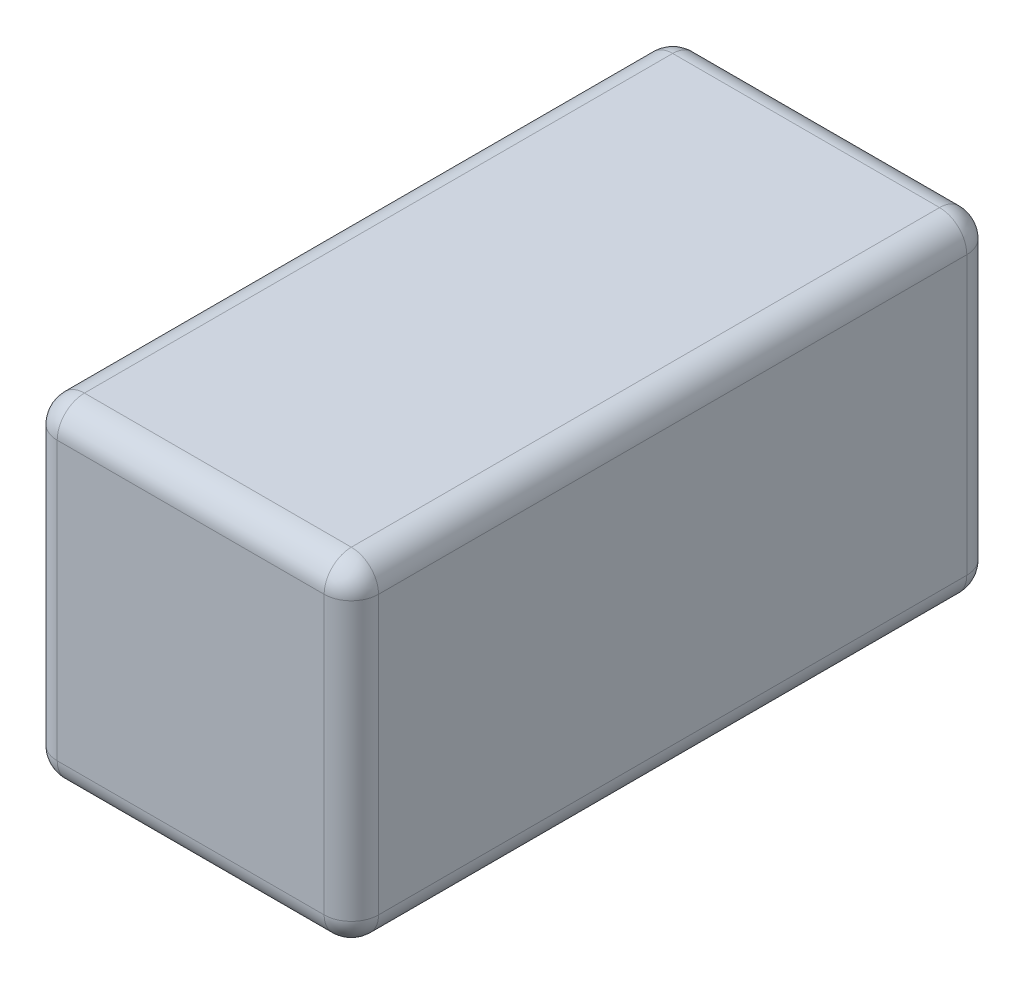
ISO-10303-21;
HEADER;
FILE_DESCRIPTION(('STEP AP214'),'2;1');
FILE_NAME('part.step','',(''),(''),'','','');
FILE_SCHEMA(('AUTOMOTIVE_DESIGN { 1 0 10303 214 1 1 1 1 }'));
ENDSEC;
DATA;
#1=APPLICATION_CONTEXT('core data for automotive mechanical design processes');
#2=APPLICATION_PROTOCOL_DEFINITION('international standard','automotive_design',2000,#1);
#3=PRODUCT_CONTEXT('',#1,'mechanical');
#4=PRODUCT('Part','Part','',(#3));
#5=PRODUCT_RELATED_PRODUCT_CATEGORY('part','',(#4));
#6=PRODUCT_DEFINITION_FORMATION('','',#4);
#7=PRODUCT_DEFINITION_CONTEXT('part definition',#1,'design');
#8=PRODUCT_DEFINITION('design','',#6,#7);
#9=PRODUCT_DEFINITION_SHAPE('','',#8);
#10=(LENGTH_UNIT() NAMED_UNIT(*) SI_UNIT(.MILLI.,.METRE.));
#11=(NAMED_UNIT(*) PLANE_ANGLE_UNIT() SI_UNIT($,.RADIAN.));
#12=(NAMED_UNIT(*) SI_UNIT($,.STERADIAN.) SOLID_ANGLE_UNIT());
#13=UNCERTAINTY_MEASURE_WITH_UNIT(LENGTH_MEASURE(1.E-05),#10,'distance_accuracy_value','');
#14=(GEOMETRIC_REPRESENTATION_CONTEXT(3) GLOBAL_UNCERTAINTY_ASSIGNED_CONTEXT((#13)) GLOBAL_UNIT_ASSIGNED_CONTEXT((#10,
#11,#12)) REPRESENTATION_CONTEXT('',''));
#15=CARTESIAN_POINT('',(0.,0.,0.));
#16=DIRECTION('',(0.,0.,1.));
#17=DIRECTION('',(1.,0.,0.));
#18=AXIS2_PLACEMENT_3D('',#15,#16,#17);
#19=CARTESIAN_POINT('',(-15.,-15.5,60.));
#20=DIRECTION('',(1.,0.,0.));
#21=DIRECTION('',(0.,0.,-1.));
#22=AXIS2_PLACEMENT_3D('',#19,#20,#21);
#23=PLANE('',#22);
#24=DIRECTION('',(0.,-1.,0.));
#25=VECTOR('',#24,1.);
#26=CARTESIAN_POINT('',(-15.,-15.5,2.54));
#27=LINE('',#26,#25);
#28=CARTESIAN_POINT('',(-15.,12.96,2.54));
#29=VERTEX_POINT('',#28);
#30=CARTESIAN_POINT('',(-15.,-12.96,2.54));
#31=VERTEX_POINT('',#30);
#32=EDGE_CURVE('E131',#29,#31,#27,.T.);
#33=ORIENTED_EDGE('',*,*,#32,.T.);
#34=DIRECTION('',(0.,0.,-1.));
#35=VECTOR('',#34,1.);
#36=CARTESIAN_POINT('',(-15.,-12.96,60.));
#37=LINE('',#36,#35);
#38=CARTESIAN_POINT('',(-15.,-12.96,57.46));
#39=VERTEX_POINT('',#38);
#40=EDGE_CURVE('E127',#31,#39,#37,.F.);
#41=ORIENTED_EDGE('',*,*,#40,.T.);
#42=DIRECTION('',(0.,-1.,0.));
#43=VECTOR('',#42,1.);
#44=CARTESIAN_POINT('',(-15.,15.5,57.46));
#45=LINE('',#44,#43);
#46=CARTESIAN_POINT('',(-15.,12.96,57.46));
#47=VERTEX_POINT('',#46);
#48=EDGE_CURVE('E120',#39,#47,#45,.F.);
#49=ORIENTED_EDGE('',*,*,#48,.T.);
#50=DIRECTION('',(0.,0.,-1.));
#51=VECTOR('',#50,1.);
#52=CARTESIAN_POINT('',(-15.,12.96,60.));
#53=LINE('',#52,#51);
#54=EDGE_CURVE('E124',#47,#29,#53,.T.);
#55=ORIENTED_EDGE('',*,*,#54,.T.);
#56=EDGE_LOOP('',(#33,#41,#49,#55));
#57=FACE_BOUND('',#56,.T.);
#58=ADVANCED_FACE('F33',(#57),#23,.F.);
#59=CARTESIAN_POINT('',(15.,-15.5,60.));
#60=DIRECTION('',(0.,1.,0.));
#61=DIRECTION('',(-1.,0.,0.));
#62=AXIS2_PLACEMENT_3D('',#59,#60,#61);
#63=PLANE('',#62);
#64=DIRECTION('',(1.,0.,0.));
#65=VECTOR('',#64,1.);
#66=CARTESIAN_POINT('',(-15.,-15.5,57.46));
#67=LINE('',#66,#65);
#68=CARTESIAN_POINT('',(12.46,-15.5,57.46));
#69=VERTEX_POINT('',#68);
#70=CARTESIAN_POINT('',(-12.46,-15.5,57.46));
#71=VERTEX_POINT('',#70);
#72=EDGE_CURVE('E183',#69,#71,#67,.F.);
#73=ORIENTED_EDGE('',*,*,#72,.T.);
#74=DIRECTION('',(0.,0.,-1.));
#75=VECTOR('',#74,1.);
#76=CARTESIAN_POINT('',(-12.46,-15.5,60.));
#77=LINE('',#76,#75);
#78=CARTESIAN_POINT('',(-12.46,-15.5,2.54));
#79=VERTEX_POINT('',#78);
#80=EDGE_CURVE('E185',#71,#79,#77,.T.);
#81=ORIENTED_EDGE('',*,*,#80,.T.);
#82=DIRECTION('',(1.,0.,0.));
#83=VECTOR('',#82,1.);
#84=CARTESIAN_POINT('',(15.,-15.5,2.54));
#85=LINE('',#84,#83);
#86=CARTESIAN_POINT('',(12.46,-15.5,2.54));
#87=VERTEX_POINT('',#86);
#88=EDGE_CURVE('E181',#79,#87,#85,.T.);
#89=ORIENTED_EDGE('',*,*,#88,.T.);
#90=DIRECTION('',(0.,0.,-1.));
#91=VECTOR('',#90,1.);
#92=CARTESIAN_POINT('',(12.46,-15.5,60.));
#93=LINE('',#92,#91);
#94=EDGE_CURVE('E179',#87,#69,#93,.F.);
#95=ORIENTED_EDGE('',*,*,#94,.T.);
#96=EDGE_LOOP('',(#73,#81,#89,#95));
#97=FACE_BOUND('',#96,.T.);
#98=ADVANCED_FACE('F263',(#97),#63,.F.);
#99=CARTESIAN_POINT('',(15.,-15.5,60.));
#100=DIRECTION('',(-1.,0.,0.));
#101=DIRECTION('',(0.,0.,1.));
#102=AXIS2_PLACEMENT_3D('',#99,#100,#101);
#103=PLANE('',#102);
#104=DIRECTION('',(0.,1.,0.));
#105=VECTOR('',#104,1.);
#106=CARTESIAN_POINT('',(15.,-15.5,57.46));
#107=LINE('',#106,#105);
#108=CARTESIAN_POINT('',(15.,12.96,57.46));
#109=VERTEX_POINT('',#108);
#110=CARTESIAN_POINT('',(15.,-12.96,57.46));
#111=VERTEX_POINT('',#110);
#112=EDGE_CURVE('E192',#109,#111,#107,.F.);
#113=ORIENTED_EDGE('',*,*,#112,.T.);
#114=DIRECTION('',(0.,0.,-1.));
#115=VECTOR('',#114,1.);
#116=CARTESIAN_POINT('',(15.,-12.96,60.));
#117=LINE('',#116,#115);
#118=CARTESIAN_POINT('',(15.,-12.96,2.54));
#119=VERTEX_POINT('',#118);
#120=EDGE_CURVE('E194',#111,#119,#117,.T.);
#121=ORIENTED_EDGE('',*,*,#120,.T.);
#122=DIRECTION('',(0.,1.,0.));
#123=VECTOR('',#122,1.);
#124=CARTESIAN_POINT('',(15.,-15.5,2.54));
#125=LINE('',#124,#123);
#126=CARTESIAN_POINT('',(15.,12.96,2.54));
#127=VERTEX_POINT('',#126);
#128=EDGE_CURVE('E190',#119,#127,#125,.T.);
#129=ORIENTED_EDGE('',*,*,#128,.T.);
#130=DIRECTION('',(0.,0.,-1.));
#131=VECTOR('',#130,1.);
#132=CARTESIAN_POINT('',(15.,12.96,60.));
#133=LINE('',#132,#131);
#134=EDGE_CURVE('E188',#127,#109,#133,.F.);
#135=ORIENTED_EDGE('',*,*,#134,.T.);
#136=EDGE_LOOP('',(#113,#121,#129,#135));
#137=FACE_BOUND('',#136,.T.);
#138=ADVANCED_FACE('F272',(#137),#103,.F.);
#139=CARTESIAN_POINT('',(15.,15.5,60.));
#140=DIRECTION('',(0.,-1.,0.));
#141=DIRECTION('',(1.,0.,0.));
#142=AXIS2_PLACEMENT_3D('',#139,#140,#141);
#143=PLANE('',#142);
#144=DIRECTION('',(-1.,0.,0.));
#145=VECTOR('',#144,1.);
#146=CARTESIAN_POINT('',(15.,15.5,57.46));
#147=LINE('',#146,#145);
#148=CARTESIAN_POINT('',(-12.46,15.5,57.46));
#149=VERTEX_POINT('',#148);
#150=CARTESIAN_POINT('',(12.46,15.5,57.46));
#151=VERTEX_POINT('',#150);
#152=EDGE_CURVE('E42',#149,#151,#147,.F.);
#153=ORIENTED_EDGE('',*,*,#152,.T.);
#154=DIRECTION('',(0.,0.,-1.));
#155=VECTOR('',#154,1.);
#156=CARTESIAN_POINT('',(12.46,15.5,60.));
#157=LINE('',#156,#155);
#158=CARTESIAN_POINT('',(12.46,15.5,2.54));
#159=VERTEX_POINT('',#158);
#160=EDGE_CURVE('E11',#151,#159,#157,.T.);
#161=ORIENTED_EDGE('',*,*,#160,.T.);
#162=DIRECTION('',(-1.,0.,0.));
#163=VECTOR('',#162,1.);
#164=CARTESIAN_POINT('',(15.,15.5,2.54));
#165=LINE('',#164,#163);
#166=CARTESIAN_POINT('',(-12.46,15.5,2.54));
#167=VERTEX_POINT('',#166);
#168=EDGE_CURVE('E197',#159,#167,#165,.T.);
#169=ORIENTED_EDGE('',*,*,#168,.T.);
#170=DIRECTION('',(0.,0.,-1.));
#171=VECTOR('',#170,1.);
#172=CARTESIAN_POINT('',(-12.46,15.5,60.));
#173=LINE('',#172,#171);
#174=EDGE_CURVE('E53',#167,#149,#173,.F.);
#175=ORIENTED_EDGE('',*,*,#174,.T.);
#176=EDGE_LOOP('',(#153,#161,#169,#175));
#177=FACE_BOUND('',#176,.T.);
#178=ADVANCED_FACE('F285',(#177),#143,.F.);
#179=CARTESIAN_POINT('',(0.,0.,60.));
#180=DIRECTION('',(0.,0.,1.));
#181=DIRECTION('',(1.,0.,0.));
#182=AXIS2_PLACEMENT_3D('',#179,#180,#181);
#183=PLANE('',#182);
#184=DIRECTION('',(-1.,0.,0.));
#185=VECTOR('',#184,1.);
#186=CARTESIAN_POINT('',(-15.,12.96,60.));
#187=LINE('',#186,#185);
#188=CARTESIAN_POINT('',(12.46,12.96,60.));
#189=VERTEX_POINT('',#188);
#190=CARTESIAN_POINT('',(-12.46,12.96,60.));
#191=VERTEX_POINT('',#190);
#192=EDGE_CURVE('E172',#189,#191,#187,.T.);
#193=ORIENTED_EDGE('',*,*,#192,.T.);
#194=DIRECTION('',(0.,-1.,0.));
#195=VECTOR('',#194,1.);
#196=CARTESIAN_POINT('',(-12.46,-15.5,60.));
#197=LINE('',#196,#195);
#198=CARTESIAN_POINT('',(-12.46,-12.96,60.));
#199=VERTEX_POINT('',#198);
#200=EDGE_CURVE('E139',#191,#199,#197,.T.);
#201=ORIENTED_EDGE('',*,*,#200,.T.);
#202=DIRECTION('',(1.,0.,0.));
#203=VECTOR('',#202,1.);
#204=CARTESIAN_POINT('',(15.,-12.96,60.));
#205=LINE('',#204,#203);
#206=CARTESIAN_POINT('',(12.46,-12.96,60.));
#207=VERTEX_POINT('',#206);
#208=EDGE_CURVE('E176',#199,#207,#205,.T.);
#209=ORIENTED_EDGE('',*,*,#208,.T.);
#210=DIRECTION('',(0.,1.,0.));
#211=VECTOR('',#210,1.);
#212=CARTESIAN_POINT('',(12.46,15.5,60.));
#213=LINE('',#212,#211);
#214=EDGE_CURVE('E174',#207,#189,#213,.T.);
#215=ORIENTED_EDGE('',*,*,#214,.T.);
#216=EDGE_LOOP('',(#193,#201,#209,#215));
#217=FACE_BOUND('',#216,.T.);
#218=ADVANCED_FACE('F477',(#217),#183,.T.);
#219=CARTESIAN_POINT('',(0.,0.,0.));
#220=DIRECTION('',(0.,0.,1.));
#221=DIRECTION('',(1.,0.,0.));
#222=AXIS2_PLACEMENT_3D('',#219,#220,#221);
#223=PLANE('',#222);
#224=DIRECTION('',(1.,0.,0.));
#225=VECTOR('',#224,1.);
#226=CARTESIAN_POINT('',(0.,-12.96,0.));
#227=LINE('',#226,#225);
#228=CARTESIAN_POINT('',(12.46,-12.96,0.));
#229=VERTEX_POINT('',#228);
#230=CARTESIAN_POINT('',(-12.46,-12.96,0.));
#231=VERTEX_POINT('',#230);
#232=EDGE_CURVE('E167',#229,#231,#227,.F.);
#233=ORIENTED_EDGE('',*,*,#232,.T.);
#234=DIRECTION('',(0.,-1.,0.));
#235=VECTOR('',#234,1.);
#236=CARTESIAN_POINT('',(-12.46,0.,0.));
#237=LINE('',#236,#235);
#238=CARTESIAN_POINT('',(-12.46,12.96,0.));
#239=VERTEX_POINT('',#238);
#240=EDGE_CURVE('E169',#231,#239,#237,.F.);
#241=ORIENTED_EDGE('',*,*,#240,.T.);
#242=DIRECTION('',(-1.,0.,0.));
#243=VECTOR('',#242,1.);
#244=CARTESIAN_POINT('',(0.,12.96,0.));
#245=LINE('',#244,#243);
#246=CARTESIAN_POINT('',(12.46,12.96,0.));
#247=VERTEX_POINT('',#246);
#248=EDGE_CURVE('E163',#239,#247,#245,.F.);
#249=ORIENTED_EDGE('',*,*,#248,.T.);
#250=DIRECTION('',(0.,1.,0.));
#251=VECTOR('',#250,1.);
#252=CARTESIAN_POINT('',(12.46,0.,0.));
#253=LINE('',#252,#251);
#254=EDGE_CURVE('E165',#247,#229,#253,.F.);
#255=ORIENTED_EDGE('',*,*,#254,.T.);
#256=EDGE_LOOP('',(#233,#241,#249,#255));
#257=FACE_BOUND('',#256,.T.);
#258=ADVANCED_FACE('F470',(#257),#223,.F.);
#259=CARTESIAN_POINT('',(12.46,0.,57.46));
#260=DIRECTION('',(0.,-1.,0.));
#261=DIRECTION('',(0.,0.,-1.));
#262=AXIS2_PLACEMENT_3D('',#259,#260,#261);
#263=CYLINDRICAL_SURFACE('',#262,2.54);
#264=CARTESIAN_POINT('',(12.46,12.96,57.46));
#265=DIRECTION('',(0.,1.,0.));
#266=DIRECTION('',(0.,0.,1.));
#267=AXIS2_PLACEMENT_3D('',#264,#265,#266);
#268=CIRCLE('',#267,2.54);
#269=EDGE_CURVE('E37',#189,#109,#268,.T.);
#270=ORIENTED_EDGE('',*,*,#269,.F.);
#271=ORIENTED_EDGE('',*,*,#214,.F.);
#272=CARTESIAN_POINT('',(12.46,-12.96,57.46));
#273=DIRECTION('',(0.,-1.,0.));
#274=DIRECTION('',(0.,0.,-1.));
#275=AXIS2_PLACEMENT_3D('',#272,#273,#274);
#276=CIRCLE('',#275,2.54);
#277=EDGE_CURVE('E159',#111,#207,#276,.T.);
#278=ORIENTED_EDGE('',*,*,#277,.F.);
#279=ORIENTED_EDGE('',*,*,#112,.F.);
#280=EDGE_LOOP('',(#270,#271,#278,#279));
#281=FACE_BOUND('',#280,.T.);
#282=ADVANCED_FACE('F35',(#281),#263,.T.);
#283=CARTESIAN_POINT('',(12.46,12.96,57.46));
#284=DIRECTION('',(0.,0.,1.));
#285=DIRECTION('',(1.,0.,0.));
#286=AXIS2_PLACEMENT_3D('',#283,#284,#285);
#287=SPHERICAL_SURFACE('',#286,2.54);
#288=CARTESIAN_POINT('',(12.46,12.96,57.46));
#289=DIRECTION('',(1.,0.,0.));
#290=DIRECTION('',(0.,0.,-1.));
#291=AXIS2_PLACEMENT_3D('',#288,#289,#290);
#292=CIRCLE('',#291,2.54);
#293=EDGE_CURVE('E242',#189,#151,#292,.F.);
#294=ORIENTED_EDGE('',*,*,#293,.F.);
#295=ORIENTED_EDGE('',*,*,#269,.T.);
#296=CARTESIAN_POINT('',(12.46,12.96,57.46));
#297=DIRECTION('',(0.,0.,1.));
#298=DIRECTION('',(1.,0.,0.));
#299=AXIS2_PLACEMENT_3D('',#296,#297,#298);
#300=CIRCLE('',#299,2.54);
#301=EDGE_CURVE('E244',#151,#109,#300,.F.);
#302=ORIENTED_EDGE('',*,*,#301,.F.);
#303=EDGE_LOOP('',(#294,#295,#302));
#304=FACE_BOUND('',#303,.T.);
#305=ADVANCED_FACE('F278',(#304),#287,.T.);
#306=CARTESIAN_POINT('',(12.46,-12.96,57.46));
#307=DIRECTION('',(0.,0.,1.));
#308=DIRECTION('',(1.,0.,0.));
#309=AXIS2_PLACEMENT_3D('',#306,#307,#308);
#310=SPHERICAL_SURFACE('',#309,2.54);
#311=CARTESIAN_POINT('',(12.46,-12.96,57.46));
#312=DIRECTION('',(0.,0.,1.));
#313=DIRECTION('',(1.,0.,0.));
#314=AXIS2_PLACEMENT_3D('',#311,#312,#313);
#315=CIRCLE('',#314,2.54);
#316=EDGE_CURVE('E236',#111,#69,#315,.F.);
#317=ORIENTED_EDGE('',*,*,#316,.F.);
#318=ORIENTED_EDGE('',*,*,#277,.T.);
#319=CARTESIAN_POINT('',(12.46,-12.96,57.46));
#320=DIRECTION('',(1.,0.,0.));
#321=DIRECTION('',(0.,0.,-1.));
#322=AXIS2_PLACEMENT_3D('',#319,#320,#321);
#323=CIRCLE('',#322,2.54);
#324=EDGE_CURVE('E239',#69,#207,#323,.F.);
#325=ORIENTED_EDGE('',*,*,#324,.F.);
#326=EDGE_LOOP('',(#317,#318,#325));
#327=FACE_BOUND('',#326,.T.);
#328=ADVANCED_FACE('F251',(#327),#310,.T.);
#329=CARTESIAN_POINT('',(12.46,12.96,60.));
#330=DIRECTION('',(0.,0.,-1.));
#331=DIRECTION('',(-1.,0.,0.));
#332=AXIS2_PLACEMENT_3D('',#329,#330,#331);
#333=CYLINDRICAL_SURFACE('',#332,2.54);
#334=ORIENTED_EDGE('',*,*,#301,.T.);
#335=ORIENTED_EDGE('',*,*,#134,.F.);
#336=CARTESIAN_POINT('',(12.46,12.96,2.54));
#337=DIRECTION('',(0.,0.,-1.));
#338=DIRECTION('',(-1.,0.,0.));
#339=AXIS2_PLACEMENT_3D('',#336,#337,#338);
#340=CIRCLE('',#339,2.54);
#341=EDGE_CURVE('E230',#159,#127,#340,.T.);
#342=ORIENTED_EDGE('',*,*,#341,.F.);
#343=ORIENTED_EDGE('',*,*,#160,.F.);
#344=EDGE_LOOP('',(#334,#335,#342,#343));
#345=FACE_BOUND('',#344,.T.);
#346=ADVANCED_FACE('F282',(#345),#333,.T.);
#347=CARTESIAN_POINT('',(0.,12.96,57.46));
#348=DIRECTION('',(1.,0.,0.));
#349=DIRECTION('',(0.,1.,0.));
#350=AXIS2_PLACEMENT_3D('',#347,#348,#349);
#351=CYLINDRICAL_SURFACE('',#350,2.54);
#352=ORIENTED_EDGE('',*,*,#293,.T.);
#353=ORIENTED_EDGE('',*,*,#152,.F.);
#354=CARTESIAN_POINT('',(-12.46,12.96,57.46));
#355=DIRECTION('',(-1.,0.,0.));
#356=DIRECTION('',(0.,0.,1.));
#357=AXIS2_PLACEMENT_3D('',#354,#355,#356);
#358=CIRCLE('',#357,2.54);
#359=EDGE_CURVE('E143',#191,#149,#358,.T.);
#360=ORIENTED_EDGE('',*,*,#359,.F.);
#361=ORIENTED_EDGE('',*,*,#192,.F.);
#362=EDGE_LOOP('',(#352,#353,#360,#361));
#363=FACE_BOUND('',#362,.T.);
#364=ADVANCED_FACE('F434',(#363),#351,.T.);
#365=CARTESIAN_POINT('',(-12.46,0.,57.46));
#366=DIRECTION('',(0.,1.,0.));
#367=DIRECTION('',(0.,0.,1.));
#368=AXIS2_PLACEMENT_3D('',#365,#366,#367);
#369=CYLINDRICAL_SURFACE('',#368,2.54);
#370=CARTESIAN_POINT('',(-12.46,-12.96,57.46));
#371=DIRECTION('',(0.,-1.,0.));
#372=DIRECTION('',(0.,0.,-1.));
#373=AXIS2_PLACEMENT_3D('',#370,#371,#372);
#374=CIRCLE('',#373,2.54);
#375=EDGE_CURVE('E144',#199,#39,#374,.T.);
#376=ORIENTED_EDGE('',*,*,#375,.F.);
#377=ORIENTED_EDGE('',*,*,#200,.F.);
#378=CARTESIAN_POINT('',(-12.46,12.96,57.46));
#379=DIRECTION('',(0.,1.,0.));
#380=DIRECTION('',(0.,0.,1.));
#381=AXIS2_PLACEMENT_3D('',#378,#379,#380);
#382=CIRCLE('',#381,2.54);
#383=EDGE_CURVE('E135',#47,#191,#382,.T.);
#384=ORIENTED_EDGE('',*,*,#383,.F.);
#385=ORIENTED_EDGE('',*,*,#48,.F.);
#386=EDGE_LOOP('',(#376,#377,#384,#385));
#387=FACE_BOUND('',#386,.T.);
#388=ADVANCED_FACE('F137',(#387),#369,.T.);
#389=CARTESIAN_POINT('',(0.,-12.96,57.46));
#390=DIRECTION('',(-1.,0.,0.));
#391=DIRECTION('',(0.,-1.,0.));
#392=AXIS2_PLACEMENT_3D('',#389,#390,#391);
#393=CYLINDRICAL_SURFACE('',#392,2.54);
#394=ORIENTED_EDGE('',*,*,#324,.T.);
#395=ORIENTED_EDGE('',*,*,#208,.F.);
#396=CARTESIAN_POINT('',(-12.46,-12.96,57.46));
#397=DIRECTION('',(-1.,0.,0.));
#398=DIRECTION('',(0.,0.,1.));
#399=AXIS2_PLACEMENT_3D('',#396,#397,#398);
#400=CIRCLE('',#399,2.54);
#401=EDGE_CURVE('E226',#71,#199,#400,.T.);
#402=ORIENTED_EDGE('',*,*,#401,.F.);
#403=ORIENTED_EDGE('',*,*,#72,.F.);
#404=EDGE_LOOP('',(#394,#395,#402,#403));
#405=FACE_BOUND('',#404,.T.);
#406=ADVANCED_FACE('F259',(#405),#393,.T.);
#407=CARTESIAN_POINT('',(12.46,-12.96,60.));
#408=DIRECTION('',(0.,0.,-1.));
#409=DIRECTION('',(-1.,0.,0.));
#410=AXIS2_PLACEMENT_3D('',#407,#408,#409);
#411=CYLINDRICAL_SURFACE('',#410,2.54);
#412=ORIENTED_EDGE('',*,*,#316,.T.);
#413=ORIENTED_EDGE('',*,*,#94,.F.);
#414=CARTESIAN_POINT('',(12.46,-12.96,2.54));
#415=DIRECTION('',(0.,0.,-1.));
#416=DIRECTION('',(-1.,0.,0.));
#417=AXIS2_PLACEMENT_3D('',#414,#415,#416);
#418=CIRCLE('',#417,2.54);
#419=EDGE_CURVE('E223',#119,#87,#418,.T.);
#420=ORIENTED_EDGE('',*,*,#419,.F.);
#421=ORIENTED_EDGE('',*,*,#120,.F.);
#422=EDGE_LOOP('',(#412,#413,#420,#421));
#423=FACE_BOUND('',#422,.T.);
#424=ADVANCED_FACE('F269',(#423),#411,.T.);
#425=CARTESIAN_POINT('',(12.46,-15.5,2.54));
#426=DIRECTION('',(0.,1.,0.));
#427=DIRECTION('',(0.,0.,1.));
#428=AXIS2_PLACEMENT_3D('',#425,#426,#427);
#429=CYLINDRICAL_SURFACE('',#428,2.54);
#430=CARTESIAN_POINT('',(12.46,12.96,2.54));
#431=DIRECTION('',(0.,1.,0.));
#432=DIRECTION('',(0.,0.,1.));
#433=AXIS2_PLACEMENT_3D('',#430,#431,#432);
#434=CIRCLE('',#433,2.54);
#435=EDGE_CURVE('E233',#127,#247,#434,.T.);
#436=ORIENTED_EDGE('',*,*,#435,.F.);
#437=ORIENTED_EDGE('',*,*,#128,.F.);
#438=CARTESIAN_POINT('',(12.46,-12.96,2.54));
#439=DIRECTION('',(0.,-1.,0.));
#440=DIRECTION('',(0.,0.,-1.));
#441=AXIS2_PLACEMENT_3D('',#438,#439,#440);
#442=CIRCLE('',#441,2.54);
#443=EDGE_CURVE('E221',#229,#119,#442,.T.);
#444=ORIENTED_EDGE('',*,*,#443,.F.);
#445=ORIENTED_EDGE('',*,*,#254,.F.);
#446=EDGE_LOOP('',(#436,#437,#444,#445));
#447=FACE_BOUND('',#446,.T.);
#448=ADVANCED_FACE('F403',(#447),#429,.T.);
#449=CARTESIAN_POINT('',(12.46,12.96,2.54));
#450=DIRECTION('',(0.,0.,1.));
#451=DIRECTION('',(1.,0.,0.));
#452=AXIS2_PLACEMENT_3D('',#449,#450,#451);
#453=SPHERICAL_SURFACE('',#452,2.54);
#454=ORIENTED_EDGE('',*,*,#341,.T.);
#455=ORIENTED_EDGE('',*,*,#435,.T.);
#456=CARTESIAN_POINT('',(12.46,12.96,2.54));
#457=DIRECTION('',(1.,0.,0.));
#458=DIRECTION('',(0.,0.,-1.));
#459=AXIS2_PLACEMENT_3D('',#456,#457,#458);
#460=CIRCLE('',#459,2.54);
#461=EDGE_CURVE('E150',#159,#247,#460,.F.);
#462=ORIENTED_EDGE('',*,*,#461,.F.);
#463=EDGE_LOOP('',(#454,#455,#462));
#464=FACE_BOUND('',#463,.T.);
#465=ADVANCED_FACE('F315',(#464),#453,.T.);
#466=CARTESIAN_POINT('',(-12.46,12.96,57.46));
#467=DIRECTION('',(0.,0.,1.));
#468=DIRECTION('',(1.,0.,0.));
#469=AXIS2_PLACEMENT_3D('',#466,#467,#468);
#470=SPHERICAL_SURFACE('',#469,2.54);
#471=ORIENTED_EDGE('',*,*,#383,.T.);
#472=ORIENTED_EDGE('',*,*,#359,.T.);
#473=CARTESIAN_POINT('',(-12.46,12.96,57.46));
#474=DIRECTION('',(0.,0.,1.));
#475=DIRECTION('',(1.,0.,0.));
#476=AXIS2_PLACEMENT_3D('',#473,#474,#475);
#477=CIRCLE('',#476,2.54);
#478=EDGE_CURVE('E147',#47,#149,#477,.F.);
#479=ORIENTED_EDGE('',*,*,#478,.F.);
#480=EDGE_LOOP('',(#471,#472,#479));
#481=FACE_BOUND('',#480,.T.);
#482=ADVANCED_FACE('F148',(#481),#470,.T.);
#483=CARTESIAN_POINT('',(-12.46,-12.96,57.46));
#484=DIRECTION('',(0.,0.,1.));
#485=DIRECTION('',(1.,0.,0.));
#486=AXIS2_PLACEMENT_3D('',#483,#484,#485);
#487=SPHERICAL_SURFACE('',#486,2.54);
#488=ORIENTED_EDGE('',*,*,#401,.T.);
#489=ORIENTED_EDGE('',*,*,#375,.T.);
#490=CARTESIAN_POINT('',(-12.46,-12.96,57.46));
#491=DIRECTION('',(0.,0.,1.));
#492=DIRECTION('',(1.,0.,0.));
#493=AXIS2_PLACEMENT_3D('',#490,#491,#492);
#494=CIRCLE('',#493,2.54);
#495=EDGE_CURVE('E151',#71,#39,#494,.F.);
#496=ORIENTED_EDGE('',*,*,#495,.F.);
#497=EDGE_LOOP('',(#488,#489,#496));
#498=FACE_BOUND('',#497,.T.);
#499=ADVANCED_FACE('F305',(#498),#487,.T.);
#500=CARTESIAN_POINT('',(12.46,-12.96,2.54));
#501=DIRECTION('',(0.,0.,1.));
#502=DIRECTION('',(1.,0.,0.));
#503=AXIS2_PLACEMENT_3D('',#500,#501,#502);
#504=SPHERICAL_SURFACE('',#503,2.54);
#505=ORIENTED_EDGE('',*,*,#443,.T.);
#506=ORIENTED_EDGE('',*,*,#419,.T.);
#507=CARTESIAN_POINT('',(12.46,-12.96,2.54));
#508=DIRECTION('',(1.,0.,0.));
#509=DIRECTION('',(0.,0.,-1.));
#510=AXIS2_PLACEMENT_3D('',#507,#508,#509);
#511=CIRCLE('',#510,2.54);
#512=EDGE_CURVE('E214',#229,#87,#511,.F.);
#513=ORIENTED_EDGE('',*,*,#512,.F.);
#514=EDGE_LOOP('',(#505,#506,#513));
#515=FACE_BOUND('',#514,.T.);
#516=ADVANCED_FACE('F307',(#515),#504,.T.);
#517=CARTESIAN_POINT('',(15.,12.96,2.54));
#518=DIRECTION('',(-1.,0.,0.));
#519=DIRECTION('',(0.,-1.,0.));
#520=AXIS2_PLACEMENT_3D('',#517,#518,#519);
#521=CYLINDRICAL_SURFACE('',#520,2.54);
#522=ORIENTED_EDGE('',*,*,#461,.T.);
#523=ORIENTED_EDGE('',*,*,#248,.F.);
#524=CARTESIAN_POINT('',(-12.46,12.96,2.54));
#525=DIRECTION('',(-1.,0.,0.));
#526=DIRECTION('',(0.,0.,1.));
#527=AXIS2_PLACEMENT_3D('',#524,#525,#526);
#528=CIRCLE('',#527,2.54);
#529=EDGE_CURVE('E211',#167,#239,#528,.T.);
#530=ORIENTED_EDGE('',*,*,#529,.F.);
#531=ORIENTED_EDGE('',*,*,#168,.F.);
#532=EDGE_LOOP('',(#522,#523,#530,#531));
#533=FACE_BOUND('',#532,.T.);
#534=ADVANCED_FACE('F290',(#533),#521,.T.);
#535=CARTESIAN_POINT('',(-12.46,12.96,60.));
#536=DIRECTION('',(0.,0.,-1.));
#537=DIRECTION('',(-1.,0.,0.));
#538=AXIS2_PLACEMENT_3D('',#535,#536,#537);
#539=CYLINDRICAL_SURFACE('',#538,2.54);
#540=ORIENTED_EDGE('',*,*,#478,.T.);
#541=ORIENTED_EDGE('',*,*,#174,.F.);
#542=CARTESIAN_POINT('',(-12.46,12.96,2.54));
#543=DIRECTION('',(0.,0.,-1.));
#544=DIRECTION('',(-1.,0.,0.));
#545=AXIS2_PLACEMENT_3D('',#542,#543,#544);
#546=CIRCLE('',#545,2.54);
#547=EDGE_CURVE('E155',#29,#167,#546,.T.);
#548=ORIENTED_EDGE('',*,*,#547,.F.);
#549=ORIENTED_EDGE('',*,*,#54,.F.);
#550=EDGE_LOOP('',(#540,#541,#548,#549));
#551=FACE_BOUND('',#550,.T.);
#552=ADVANCED_FACE('F153',(#551),#539,.T.);
#553=CARTESIAN_POINT('',(-12.46,-12.96,60.));
#554=DIRECTION('',(0.,0.,-1.));
#555=DIRECTION('',(-1.,0.,0.));
#556=AXIS2_PLACEMENT_3D('',#553,#554,#555);
#557=CYLINDRICAL_SURFACE('',#556,2.54);
#558=ORIENTED_EDGE('',*,*,#495,.T.);
#559=ORIENTED_EDGE('',*,*,#40,.F.);
#560=CARTESIAN_POINT('',(-12.46,-12.96,2.54));
#561=DIRECTION('',(0.,0.,-1.));
#562=DIRECTION('',(-1.,0.,0.));
#563=AXIS2_PLACEMENT_3D('',#560,#561,#562);
#564=CIRCLE('',#563,2.54);
#565=EDGE_CURVE('E207',#79,#31,#564,.T.);
#566=ORIENTED_EDGE('',*,*,#565,.F.);
#567=ORIENTED_EDGE('',*,*,#80,.F.);
#568=EDGE_LOOP('',(#558,#559,#566,#567));
#569=FACE_BOUND('',#568,.T.);
#570=ADVANCED_FACE('F303',(#569),#557,.T.);
#571=CARTESIAN_POINT('',(15.,-12.96,2.54));
#572=DIRECTION('',(1.,0.,0.));
#573=DIRECTION('',(0.,1.,0.));
#574=AXIS2_PLACEMENT_3D('',#571,#572,#573);
#575=CYLINDRICAL_SURFACE('',#574,2.54);
#576=ORIENTED_EDGE('',*,*,#512,.T.);
#577=ORIENTED_EDGE('',*,*,#88,.F.);
#578=CARTESIAN_POINT('',(-12.46,-12.96,2.54));
#579=DIRECTION('',(-1.,0.,0.));
#580=DIRECTION('',(0.,0.,1.));
#581=AXIS2_PLACEMENT_3D('',#578,#579,#580);
#582=CIRCLE('',#581,2.54);
#583=EDGE_CURVE('E205',#231,#79,#582,.T.);
#584=ORIENTED_EDGE('',*,*,#583,.F.);
#585=ORIENTED_EDGE('',*,*,#232,.F.);
#586=EDGE_LOOP('',(#576,#577,#584,#585));
#587=FACE_BOUND('',#586,.T.);
#588=ADVANCED_FACE('F331',(#587),#575,.T.);
#589=CARTESIAN_POINT('',(-12.46,12.96,2.54));
#590=DIRECTION('',(0.,0.,1.));
#591=DIRECTION('',(1.,0.,0.));
#592=AXIS2_PLACEMENT_3D('',#589,#590,#591);
#593=SPHERICAL_SURFACE('',#592,2.54);
#594=ORIENTED_EDGE('',*,*,#547,.T.);
#595=ORIENTED_EDGE('',*,*,#529,.T.);
#596=CARTESIAN_POINT('',(-12.46,12.96,2.54));
#597=DIRECTION('',(0.,1.,0.));
#598=DIRECTION('',(0.,0.,1.));
#599=AXIS2_PLACEMENT_3D('',#596,#597,#598);
#600=CIRCLE('',#599,2.54);
#601=EDGE_CURVE('E203',#29,#239,#600,.F.);
#602=ORIENTED_EDGE('',*,*,#601,.F.);
#603=EDGE_LOOP('',(#594,#595,#602));
#604=FACE_BOUND('',#603,.T.);
#605=ADVANCED_FACE('F292',(#604),#593,.T.);
#606=CARTESIAN_POINT('',(-12.46,-12.96,2.54));
#607=DIRECTION('',(0.,0.,1.));
#608=DIRECTION('',(1.,0.,0.));
#609=AXIS2_PLACEMENT_3D('',#606,#607,#608);
#610=SPHERICAL_SURFACE('',#609,2.54);
#611=ORIENTED_EDGE('',*,*,#583,.T.);
#612=ORIENTED_EDGE('',*,*,#565,.T.);
#613=CARTESIAN_POINT('',(-12.46,-12.96,2.54));
#614=DIRECTION('',(0.,-1.,0.));
#615=DIRECTION('',(0.,0.,-1.));
#616=AXIS2_PLACEMENT_3D('',#613,#614,#615);
#617=CIRCLE('',#616,2.54);
#618=EDGE_CURVE('E201',#231,#31,#617,.F.);
#619=ORIENTED_EDGE('',*,*,#618,.F.);
#620=EDGE_LOOP('',(#611,#612,#619));
#621=FACE_BOUND('',#620,.T.);
#622=ADVANCED_FACE('F300',(#621),#610,.T.);
#623=CARTESIAN_POINT('',(-12.46,-15.5,2.54));
#624=DIRECTION('',(0.,-1.,0.));
#625=DIRECTION('',(0.,0.,-1.));
#626=AXIS2_PLACEMENT_3D('',#623,#624,#625);
#627=CYLINDRICAL_SURFACE('',#626,2.54);
#628=ORIENTED_EDGE('',*,*,#601,.T.);
#629=ORIENTED_EDGE('',*,*,#240,.F.);
#630=ORIENTED_EDGE('',*,*,#618,.T.);
#631=ORIENTED_EDGE('',*,*,#32,.F.);
#632=EDGE_LOOP('',(#628,#629,#630,#631));
#633=FACE_BOUND('',#632,.T.);
#634=ADVANCED_FACE('F296',(#633),#627,.T.);
#635=CLOSED_SHELL('',(#58,#98,#138,#178,#218,#258,#282,#305,#328,#346,#364,#388,#406,#424,#448,
#465,#482,#499,#516,#534,#552,#570,#588,#605,#622,#634));
#636=MANIFOLD_SOLID_BREP('B2',#635);
#637=ADVANCED_BREP_SHAPE_REPRESENTATION('',(#18,#636),#14);
#638=SHAPE_DEFINITION_REPRESENTATION(#9,#637);
ENDSEC;
END-ISO-10303-21;
